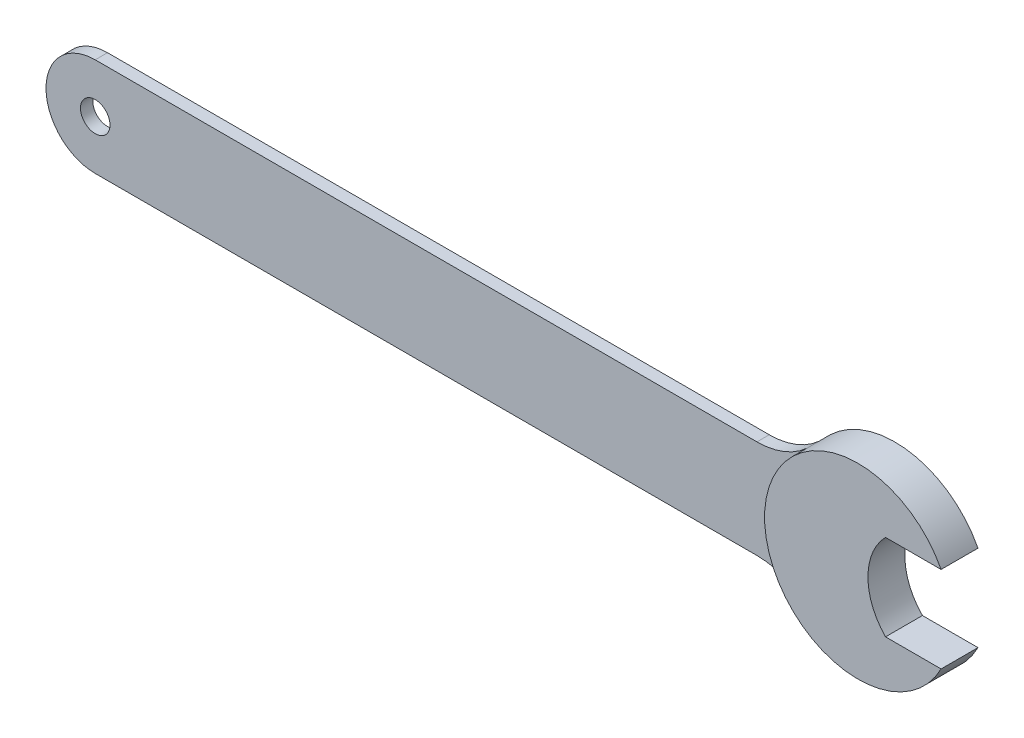
ISO-10303-21;
HEADER;
FILE_DESCRIPTION(('STEP AP214'),'2;1');
FILE_NAME('part.step','',(''),(''),'','','');
FILE_SCHEMA(('AUTOMOTIVE_DESIGN { 1 0 10303 214 1 1 1 1 }'));
ENDSEC;
DATA;
#1=APPLICATION_CONTEXT('core data for automotive mechanical design processes');
#2=APPLICATION_PROTOCOL_DEFINITION('international standard','automotive_design',2000,#1);
#3=PRODUCT_CONTEXT('',#1,'mechanical');
#4=PRODUCT('Part','Part','',(#3));
#5=PRODUCT_RELATED_PRODUCT_CATEGORY('part','',(#4));
#6=PRODUCT_DEFINITION_FORMATION('','',#4);
#7=PRODUCT_DEFINITION_CONTEXT('part definition',#1,'design');
#8=PRODUCT_DEFINITION('design','',#6,#7);
#9=PRODUCT_DEFINITION_SHAPE('','',#8);
#10=(LENGTH_UNIT() NAMED_UNIT(*) SI_UNIT(.MILLI.,.METRE.));
#11=(NAMED_UNIT(*) PLANE_ANGLE_UNIT() SI_UNIT($,.RADIAN.));
#12=(NAMED_UNIT(*) SI_UNIT($,.STERADIAN.) SOLID_ANGLE_UNIT());
#13=UNCERTAINTY_MEASURE_WITH_UNIT(LENGTH_MEASURE(1.E-05),#10,'distance_accuracy_value','');
#14=(GEOMETRIC_REPRESENTATION_CONTEXT(3) GLOBAL_UNCERTAINTY_ASSIGNED_CONTEXT((#13)) GLOBAL_UNIT_ASSIGNED_CONTEXT((#10,
#11,#12)) REPRESENTATION_CONTEXT('',''));
#15=CARTESIAN_POINT('',(0.,0.,0.));
#16=DIRECTION('',(0.,0.,1.));
#17=DIRECTION('',(1.,0.,0.));
#18=AXIS2_PLACEMENT_3D('',#15,#16,#17);
#19=CARTESIAN_POINT('',(268.913125512788,-50.,2.5));
#20=DIRECTION('',(0.,0.,-1.));
#21=DIRECTION('',(-1.,0.,0.));
#22=AXIS2_PLACEMENT_3D('',#19,#20,#21);
#23=CYLINDRICAL_SURFACE('',#22,30.);
#24=CARTESIAN_POINT('',(268.913125512788,-50.,-2.5));
#25=DIRECTION('',(0.,0.,1.));
#26=DIRECTION('',(1.,0.,0.));
#27=AXIS2_PLACEMENT_3D('',#24,#25,#26);
#28=CIRCLE('',#27,30.);
#29=CARTESIAN_POINT('',(268.913125512788,-20.,-2.5));
#30=VERTEX_POINT('',#29);
#31=CARTESIAN_POINT('',(289.245570139499,-27.9411764705882,-2.5));
#32=VERTEX_POINT('',#31);
#33=EDGE_CURVE('E153',#30,#32,#28,.F.);
#34=ORIENTED_EDGE('',*,*,#33,.T.);
#35=DIRECTION('',(0.,0.,-1.));
#36=VECTOR('',#35,1.);
#37=CARTESIAN_POINT('',(289.245570139499,-27.9411764705882,2.5));
#38=LINE('',#37,#36);
#39=CARTESIAN_POINT('',(289.245570139499,-27.9411764705882,2.5));
#40=VERTEX_POINT('',#39);
#41=EDGE_CURVE('E11',#40,#32,#38,.T.);
#42=ORIENTED_EDGE('',*,*,#41,.F.);
#43=CARTESIAN_POINT('',(268.913125512788,-50.,2.5));
#44=DIRECTION('',(0.,0.,1.));
#45=DIRECTION('',(1.,0.,0.));
#46=AXIS2_PLACEMENT_3D('',#43,#44,#45);
#47=CIRCLE('',#46,30.);
#48=CARTESIAN_POINT('',(268.913125512788,-20.,2.5));
#49=VERTEX_POINT('',#48);
#50=EDGE_CURVE('E158',#49,#40,#47,.F.);
#51=ORIENTED_EDGE('',*,*,#50,.F.);
#52=DIRECTION('',(0.,0.,-1.));
#53=VECTOR('',#52,1.);
#54=CARTESIAN_POINT('',(268.913125512788,-20.,2.5));
#55=LINE('',#54,#53);
#56=EDGE_CURVE('E172',#49,#30,#55,.T.);
#57=ORIENTED_EDGE('',*,*,#56,.T.);
#58=EDGE_LOOP('',(#34,#42,#51,#57));
#59=FACE_BOUND('',#58,.T.);
#60=ADVANCED_FACE('F39',(#59),#23,.F.);
#61=CARTESIAN_POINT('',(268.913125512788,50.,2.5));
#62=DIRECTION('',(0.,0.,-1.));
#63=DIRECTION('',(-1.,0.,0.));
#64=AXIS2_PLACEMENT_3D('',#61,#62,#63);
#65=CYLINDRICAL_SURFACE('',#64,30.);
#66=CARTESIAN_POINT('',(268.913125512788,50.,-2.5));
#67=DIRECTION('',(0.,0.,1.));
#68=DIRECTION('',(1.,0.,0.));
#69=AXIS2_PLACEMENT_3D('',#66,#67,#68);
#70=CIRCLE('',#69,30.);
#71=CARTESIAN_POINT('',(268.913125512788,20.,-2.5));
#72=VERTEX_POINT('',#71);
#73=CARTESIAN_POINT('',(289.245570139499,27.9411764705883,-2.5));
#74=VERTEX_POINT('',#73);
#75=EDGE_CURVE('E177',#72,#74,#70,.T.);
#76=ORIENTED_EDGE('',*,*,#75,.F.);
#77=DIRECTION('',(0.,0.,-1.));
#78=VECTOR('',#77,1.);
#79=CARTESIAN_POINT('',(268.913125512788,20.,2.5));
#80=LINE('',#79,#78);
#81=CARTESIAN_POINT('',(268.913125512788,20.,2.5));
#82=VERTEX_POINT('',#81);
#83=EDGE_CURVE('E90',#82,#72,#80,.T.);
#84=ORIENTED_EDGE('',*,*,#83,.F.);
#85=CARTESIAN_POINT('',(268.913125512788,50.,2.5));
#86=DIRECTION('',(0.,0.,1.));
#87=DIRECTION('',(1.,0.,0.));
#88=AXIS2_PLACEMENT_3D('',#85,#86,#87);
#89=CIRCLE('',#88,30.);
#90=CARTESIAN_POINT('',(289.245570139499,27.9411764705883,2.5));
#91=VERTEX_POINT('',#90);
#92=EDGE_CURVE('E164',#82,#91,#89,.T.);
#93=ORIENTED_EDGE('',*,*,#92,.T.);
#94=DIRECTION('',(0.,0.,-1.));
#95=VECTOR('',#94,1.);
#96=CARTESIAN_POINT('',(289.245570139499,27.9411764705883,2.5));
#97=LINE('',#96,#95);
#98=EDGE_CURVE('E50',#91,#74,#97,.T.);
#99=ORIENTED_EDGE('',*,*,#98,.T.);
#100=EDGE_LOOP('',(#76,#84,#93,#99));
#101=FACE_BOUND('',#100,.T.);
#102=ADVANCED_FACE('F193',(#101),#65,.F.);
#103=CARTESIAN_POINT('',(0.,20.,2.5));
#104=DIRECTION('',(0.,1.,0.));
#105=DIRECTION('',(-1.,0.,0.));
#106=AXIS2_PLACEMENT_3D('',#103,#104,#105);
#107=PLANE('',#106);
#108=DIRECTION('',(1.,0.,0.));
#109=VECTOR('',#108,1.);
#110=CARTESIAN_POINT('',(0.,20.,-2.5));
#111=LINE('',#110,#109);
#112=CARTESIAN_POINT('',(0.,20.,-2.5));
#113=VERTEX_POINT('',#112);
#114=EDGE_CURVE('E185',#113,#72,#111,.T.);
#115=ORIENTED_EDGE('',*,*,#114,.F.);
#116=DIRECTION('',(0.,0.,-1.));
#117=VECTOR('',#116,1.);
#118=CARTESIAN_POINT('',(0.,20.,2.5));
#119=LINE('',#118,#117);
#120=CARTESIAN_POINT('',(0.,20.,2.5));
#121=VERTEX_POINT('',#120);
#122=EDGE_CURVE('E195',#121,#113,#119,.T.);
#123=ORIENTED_EDGE('',*,*,#122,.F.);
#124=DIRECTION('',(1.,0.,0.));
#125=VECTOR('',#124,1.);
#126=CARTESIAN_POINT('',(0.,20.,2.5));
#127=LINE('',#126,#125);
#128=EDGE_CURVE('E167',#121,#82,#127,.T.);
#129=ORIENTED_EDGE('',*,*,#128,.T.);
#130=ORIENTED_EDGE('',*,*,#83,.T.);
#131=EDGE_LOOP('',(#115,#123,#129,#130));
#132=FACE_BOUND('',#131,.T.);
#133=ADVANCED_FACE('F204',(#132),#107,.T.);
#134=CARTESIAN_POINT('',(0.,0.,2.5));
#135=DIRECTION('',(0.,0.,-1.));
#136=DIRECTION('',(-1.,0.,0.));
#137=AXIS2_PLACEMENT_3D('',#134,#135,#136);
#138=CYLINDRICAL_SURFACE('',#137,20.);
#139=CARTESIAN_POINT('',(0.,0.,-2.5));
#140=DIRECTION('',(0.,0.,1.));
#141=DIRECTION('',(1.,0.,0.));
#142=AXIS2_PLACEMENT_3D('',#139,#140,#141);
#143=CIRCLE('',#142,20.);
#144=CARTESIAN_POINT('',(0.,-20.,-2.5));
#145=VERTEX_POINT('',#144);
#146=EDGE_CURVE('E72',#113,#145,#143,.T.);
#147=ORIENTED_EDGE('',*,*,#146,.T.);
#148=DIRECTION('',(0.,0.,-1.));
#149=VECTOR('',#148,1.);
#150=CARTESIAN_POINT('',(0.,-20.,2.5));
#151=LINE('',#150,#149);
#152=CARTESIAN_POINT('',(0.,-20.,2.5));
#153=VERTEX_POINT('',#152);
#154=EDGE_CURVE('E189',#153,#145,#151,.T.);
#155=ORIENTED_EDGE('',*,*,#154,.F.);
#156=CARTESIAN_POINT('',(0.,0.,2.5));
#157=DIRECTION('',(0.,0.,1.));
#158=DIRECTION('',(1.,0.,0.));
#159=AXIS2_PLACEMENT_3D('',#156,#157,#158);
#160=CIRCLE('',#159,20.);
#161=EDGE_CURVE('E169',#121,#153,#160,.T.);
#162=ORIENTED_EDGE('',*,*,#161,.F.);
#163=ORIENTED_EDGE('',*,*,#122,.T.);
#164=EDGE_LOOP('',(#147,#155,#162,#163));
#165=FACE_BOUND('',#164,.T.);
#166=ADVANCED_FACE('F211',(#165),#138,.T.);
#167=CARTESIAN_POINT('',(0.,-20.,2.5));
#168=DIRECTION('',(0.,1.,0.));
#169=DIRECTION('',(-1.,0.,0.));
#170=AXIS2_PLACEMENT_3D('',#167,#168,#169);
#171=PLANE('',#170);
#172=DIRECTION('',(1.,0.,0.));
#173=VECTOR('',#172,1.);
#174=CARTESIAN_POINT('',(0.,-20.,-2.5));
#175=LINE('',#174,#173);
#176=EDGE_CURVE('E79',#145,#30,#175,.T.);
#177=ORIENTED_EDGE('',*,*,#176,.T.);
#178=ORIENTED_EDGE('',*,*,#56,.F.);
#179=DIRECTION('',(1.,0.,0.));
#180=VECTOR('',#179,1.);
#181=CARTESIAN_POINT('',(0.,-20.,2.5));
#182=LINE('',#181,#180);
#183=EDGE_CURVE('E54',#153,#49,#182,.T.);
#184=ORIENTED_EDGE('',*,*,#183,.F.);
#185=ORIENTED_EDGE('',*,*,#154,.T.);
#186=EDGE_LOOP('',(#177,#178,#184,#185));
#187=FACE_BOUND('',#186,.T.);
#188=ADVANCED_FACE('F212',(#187),#171,.F.);
#189=CARTESIAN_POINT('',(0.,0.,2.5));
#190=DIRECTION('',(0.,0.,-1.));
#191=DIRECTION('',(-1.,0.,0.));
#192=AXIS2_PLACEMENT_3D('',#189,#190,#191);
#193=CYLINDRICAL_SURFACE('',#192,6.);
#194=CARTESIAN_POINT('',(0.,0.,2.5));
#195=DIRECTION('',(0.,0.,1.));
#196=DIRECTION('',(1.,0.,0.));
#197=AXIS2_PLACEMENT_3D('',#194,#195,#196);
#198=CIRCLE('',#197,6.);
#199=CARTESIAN_POINT('',(6.,0.,2.5));
#200=VERTEX_POINT('',#199);
#201=EDGE_CURVE('E171',#200,#200,#198,.T.);
#202=ORIENTED_EDGE('',*,*,#201,.T.);
#203=EDGE_LOOP('',(#202));
#204=FACE_BOUND('',#203,.T.);
#205=CARTESIAN_POINT('',(0.,0.,-2.5));
#206=DIRECTION('',(0.,0.,1.));
#207=DIRECTION('',(1.,0.,0.));
#208=AXIS2_PLACEMENT_3D('',#205,#206,#207);
#209=CIRCLE('',#208,6.);
#210=CARTESIAN_POINT('',(6.,0.,-2.5));
#211=VERTEX_POINT('',#210);
#212=EDGE_CURVE('E161',#211,#211,#209,.T.);
#213=ORIENTED_EDGE('',*,*,#212,.F.);
#214=EDGE_LOOP('',(#213));
#215=FACE_BOUND('',#214,.T.);
#216=ADVANCED_FACE('F217',(#204,#215),#193,.F.);
#217=CARTESIAN_POINT('',(0.,0.,2.5));
#218=DIRECTION('',(0.,0.,1.));
#219=DIRECTION('',(1.,0.,0.));
#220=AXIS2_PLACEMENT_3D('',#217,#218,#219);
#221=PLANE('',#220);
#222=ORIENTED_EDGE('',*,*,#50,.T.);
#223=CARTESIAN_POINT('',(315.,0.,2.5));
#224=DIRECTION('',(0.,0.,1.));
#225=DIRECTION('',(1.,0.,0.));
#226=AXIS2_PLACEMENT_3D('',#223,#224,#225);
#227=CIRCLE('',#226,38.);
#228=EDGE_CURVE('E165',#91,#40,#227,.T.);
#229=ORIENTED_EDGE('',*,*,#228,.F.);
#230=ORIENTED_EDGE('',*,*,#92,.F.);
#231=ORIENTED_EDGE('',*,*,#128,.F.);
#232=ORIENTED_EDGE('',*,*,#161,.T.);
#233=ORIENTED_EDGE('',*,*,#183,.T.);
#234=EDGE_LOOP('',(#222,#229,#230,#231,#232,#233));
#235=FACE_BOUND('',#234,.T.);
#236=ORIENTED_EDGE('',*,*,#201,.F.);
#237=EDGE_LOOP('',(#236));
#238=FACE_BOUND('',#237,.T.);
#239=ADVANCED_FACE('F210',(#235,#238),#221,.T.);
#240=CARTESIAN_POINT('',(0.,0.,-2.5));
#241=DIRECTION('',(0.,0.,1.));
#242=DIRECTION('',(1.,0.,0.));
#243=AXIS2_PLACEMENT_3D('',#240,#241,#242);
#244=PLANE('',#243);
#245=ORIENTED_EDGE('',*,*,#33,.F.);
#246=ORIENTED_EDGE('',*,*,#176,.F.);
#247=ORIENTED_EDGE('',*,*,#146,.F.);
#248=ORIENTED_EDGE('',*,*,#114,.T.);
#249=ORIENTED_EDGE('',*,*,#75,.T.);
#250=CARTESIAN_POINT('',(315.,0.,-2.5));
#251=DIRECTION('',(0.,0.,1.));
#252=DIRECTION('',(1.,0.,0.));
#253=AXIS2_PLACEMENT_3D('',#250,#251,#252);
#254=CIRCLE('',#253,38.);
#255=EDGE_CURVE('E152',#74,#32,#254,.T.);
#256=ORIENTED_EDGE('',*,*,#255,.T.);
#257=EDGE_LOOP('',(#245,#246,#247,#248,#249,#256));
#258=FACE_BOUND('',#257,.T.);
#259=ORIENTED_EDGE('',*,*,#212,.T.);
#260=EDGE_LOOP('',(#259));
#261=FACE_BOUND('',#260,.T.);
#262=ADVANCED_FACE('F199',(#258,#261),#244,.F.);
#263=CARTESIAN_POINT('',(315.,0.,7.5));
#264=DIRECTION('',(0.,0.,-1.));
#265=DIRECTION('',(-1.,0.,0.));
#266=AXIS2_PLACEMENT_3D('',#263,#264,#265);
#267=CYLINDRICAL_SURFACE('',#266,38.);
#268=ORIENTED_EDGE('',*,*,#98,.F.);
#269=ORIENTED_EDGE('',*,*,#228,.T.);
#270=ORIENTED_EDGE('',*,*,#41,.T.);
#271=ORIENTED_EDGE('',*,*,#255,.F.);
#272=EDGE_LOOP('',(#268,#269,#270,#271));
#273=FACE_BOUND('',#272,.T.);
#274=CARTESIAN_POINT('',(315.,0.,-7.5));
#275=DIRECTION('',(0.,0.,1.));
#276=DIRECTION('',(1.,0.,0.));
#277=AXIS2_PLACEMENT_3D('',#274,#275,#276);
#278=CIRCLE('',#277,38.);
#279=CARTESIAN_POINT('',(348.730549951046,17.5000000000001,-7.5));
#280=VERTEX_POINT('',#279);
#281=CARTESIAN_POINT('',(348.730549951046,-17.4999999999999,-7.5));
#282=VERTEX_POINT('',#281);
#283=EDGE_CURVE('E148',#280,#282,#278,.T.);
#284=ORIENTED_EDGE('',*,*,#283,.T.);
#285=DIRECTION('',(0.,0.,-1.));
#286=VECTOR('',#285,1.);
#287=CARTESIAN_POINT('',(348.730549951046,-17.4999999999999,7.5));
#288=LINE('',#287,#286);
#289=CARTESIAN_POINT('',(348.730549951046,-17.4999999999999,7.5));
#290=VERTEX_POINT('',#289);
#291=EDGE_CURVE('E127',#290,#282,#288,.T.);
#292=ORIENTED_EDGE('',*,*,#291,.F.);
#293=CARTESIAN_POINT('',(315.,0.,7.5));
#294=DIRECTION('',(0.,0.,1.));
#295=DIRECTION('',(1.,0.,0.));
#296=AXIS2_PLACEMENT_3D('',#293,#294,#295);
#297=CIRCLE('',#296,38.);
#298=CARTESIAN_POINT('',(348.730549951046,17.5000000000001,7.5));
#299=VERTEX_POINT('',#298);
#300=EDGE_CURVE('E140',#299,#290,#297,.T.);
#301=ORIENTED_EDGE('',*,*,#300,.F.);
#302=DIRECTION('',(0.,0.,-1.));
#303=VECTOR('',#302,1.);
#304=CARTESIAN_POINT('',(348.730549951046,17.5000000000001,7.5));
#305=LINE('',#304,#303);
#306=EDGE_CURVE('E351',#299,#280,#305,.T.);
#307=ORIENTED_EDGE('',*,*,#306,.T.);
#308=EDGE_LOOP('',(#284,#292,#301,#307));
#309=FACE_BOUND('',#308,.T.);
#310=ADVANCED_FACE('F149',(#273,#309),#267,.T.);
#311=CARTESIAN_POINT('',(0.,-17.5,7.5));
#312=DIRECTION('',(0.,-1.,0.));
#313=DIRECTION('',(1.,0.,0.));
#314=AXIS2_PLACEMENT_3D('',#311,#312,#313);
#315=PLANE('',#314);
#316=DIRECTION('',(-1.,0.,0.));
#317=VECTOR('',#316,1.);
#318=CARTESIAN_POINT('',(0.,-17.5,-7.5));
#319=LINE('',#318,#317);
#320=CARTESIAN_POINT('',(326.146428928643,-17.4999999999999,-7.5));
#321=VERTEX_POINT('',#320);
#322=EDGE_CURVE('E342',#282,#321,#319,.T.);
#323=ORIENTED_EDGE('',*,*,#322,.T.);
#324=DIRECTION('',(0.,0.,-1.));
#325=VECTOR('',#324,1.);
#326=CARTESIAN_POINT('',(326.146428928643,-17.4999999999999,7.5));
#327=LINE('',#326,#325);
#328=CARTESIAN_POINT('',(326.146428928643,-17.4999999999999,7.5));
#329=VERTEX_POINT('',#328);
#330=EDGE_CURVE('E135',#329,#321,#327,.T.);
#331=ORIENTED_EDGE('',*,*,#330,.F.);
#332=DIRECTION('',(-1.,0.,0.));
#333=VECTOR('',#332,1.);
#334=CARTESIAN_POINT('',(0.,-17.5,7.5));
#335=LINE('',#334,#333);
#336=EDGE_CURVE('E124',#290,#329,#335,.T.);
#337=ORIENTED_EDGE('',*,*,#336,.F.);
#338=ORIENTED_EDGE('',*,*,#291,.T.);
#339=EDGE_LOOP('',(#323,#331,#337,#338));
#340=FACE_BOUND('',#339,.T.);
#341=ADVANCED_FACE('F126',(#340),#315,.F.);
#342=CARTESIAN_POINT('',(344.,0.,7.5));
#343=DIRECTION('',(0.,0.,-1.));
#344=DIRECTION('',(-1.,0.,0.));
#345=AXIS2_PLACEMENT_3D('',#342,#343,#344);
#346=CYLINDRICAL_SURFACE('',#345,25.);
#347=CARTESIAN_POINT('',(344.,0.,-7.5));
#348=DIRECTION('',(0.,0.,1.));
#349=DIRECTION('',(1.,0.,0.));
#350=AXIS2_PLACEMENT_3D('',#347,#348,#349);
#351=CIRCLE('',#350,25.);
#352=CARTESIAN_POINT('',(326.146428928643,17.5000000000001,-7.5));
#353=VERTEX_POINT('',#352);
#354=EDGE_CURVE('E348',#353,#321,#351,.T.);
#355=ORIENTED_EDGE('',*,*,#354,.F.);
#356=DIRECTION('',(0.,0.,-1.));
#357=VECTOR('',#356,1.);
#358=CARTESIAN_POINT('',(326.146428928643,17.5000000000001,7.5));
#359=LINE('',#358,#357);
#360=CARTESIAN_POINT('',(326.146428928643,17.5000000000001,7.5));
#361=VERTEX_POINT('',#360);
#362=EDGE_CURVE('E157',#361,#353,#359,.T.);
#363=ORIENTED_EDGE('',*,*,#362,.F.);
#364=CARTESIAN_POINT('',(344.,0.,7.5));
#365=DIRECTION('',(0.,0.,1.));
#366=DIRECTION('',(1.,0.,0.));
#367=AXIS2_PLACEMENT_3D('',#364,#365,#366);
#368=CIRCLE('',#367,25.);
#369=EDGE_CURVE('E136',#361,#329,#368,.T.);
#370=ORIENTED_EDGE('',*,*,#369,.T.);
#371=ORIENTED_EDGE('',*,*,#330,.T.);
#372=EDGE_LOOP('',(#355,#363,#370,#371));
#373=FACE_BOUND('',#372,.T.);
#374=ADVANCED_FACE('F259',(#373),#346,.F.);
#375=CARTESIAN_POINT('',(0.,17.5,7.5));
#376=DIRECTION('',(0.,1.,0.));
#377=DIRECTION('',(-1.,0.,0.));
#378=AXIS2_PLACEMENT_3D('',#375,#376,#377);
#379=PLANE('',#378);
#380=DIRECTION('',(1.,0.,0.));
#381=VECTOR('',#380,1.);
#382=CARTESIAN_POINT('',(0.,17.5,-7.5));
#383=LINE('',#382,#381);
#384=EDGE_CURVE('E147',#353,#280,#383,.T.);
#385=ORIENTED_EDGE('',*,*,#384,.T.);
#386=ORIENTED_EDGE('',*,*,#306,.F.);
#387=DIRECTION('',(1.,0.,0.));
#388=VECTOR('',#387,1.);
#389=CARTESIAN_POINT('',(0.,17.5,7.5));
#390=LINE('',#389,#388);
#391=EDGE_CURVE('E145',#361,#299,#390,.T.);
#392=ORIENTED_EDGE('',*,*,#391,.F.);
#393=ORIENTED_EDGE('',*,*,#362,.T.);
#394=EDGE_LOOP('',(#385,#386,#392,#393));
#395=FACE_BOUND('',#394,.T.);
#396=ADVANCED_FACE('F268',(#395),#379,.F.);
#397=CARTESIAN_POINT('',(0.,0.,7.5));
#398=DIRECTION('',(0.,0.,1.));
#399=DIRECTION('',(1.,0.,0.));
#400=AXIS2_PLACEMENT_3D('',#397,#398,#399);
#401=PLANE('',#400);
#402=ORIENTED_EDGE('',*,*,#300,.T.);
#403=ORIENTED_EDGE('',*,*,#336,.T.);
#404=ORIENTED_EDGE('',*,*,#369,.F.);
#405=ORIENTED_EDGE('',*,*,#391,.T.);
#406=EDGE_LOOP('',(#402,#403,#404,#405));
#407=FACE_BOUND('',#406,.T.);
#408=ADVANCED_FACE('F139',(#407),#401,.T.);
#409=CARTESIAN_POINT('',(0.,0.,-7.5));
#410=DIRECTION('',(0.,0.,1.));
#411=DIRECTION('',(1.,0.,0.));
#412=AXIS2_PLACEMENT_3D('',#409,#410,#411);
#413=PLANE('',#412);
#414=ORIENTED_EDGE('',*,*,#283,.F.);
#415=ORIENTED_EDGE('',*,*,#384,.F.);
#416=ORIENTED_EDGE('',*,*,#354,.T.);
#417=ORIENTED_EDGE('',*,*,#322,.F.);
#418=EDGE_LOOP('',(#414,#415,#416,#417));
#419=FACE_BOUND('',#418,.T.);
#420=ADVANCED_FACE('F288',(#419),#413,.F.);
#421=CLOSED_SHELL('',(#60,#102,#133,#166,#188,#216,#239,#262,#310,#341,#374,#396,#408,#420));
#422=MANIFOLD_SOLID_BREP('B2',#421);
#423=ADVANCED_BREP_SHAPE_REPRESENTATION('',(#18,#422),#14);
#424=SHAPE_DEFINITION_REPRESENTATION(#9,#423);
ENDSEC;
END-ISO-10303-21;
